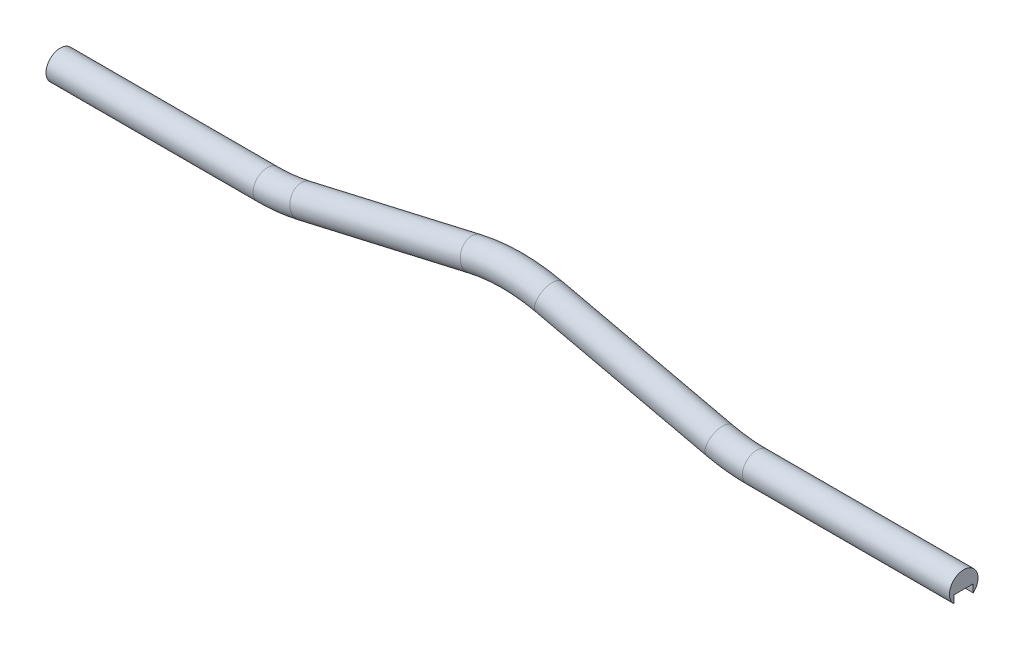
ISO-10303-21;
HEADER;
FILE_DESCRIPTION(('STEP AP214'),'2;1');
FILE_NAME('part.step','',(''),(''),'','','');
FILE_SCHEMA(('AUTOMOTIVE_DESIGN { 1 0 10303 214 1 1 1 1 }'));
ENDSEC;
DATA;
#1=APPLICATION_CONTEXT('core data for automotive mechanical design processes');
#2=APPLICATION_PROTOCOL_DEFINITION('international standard','automotive_design',2000,#1);
#3=PRODUCT_CONTEXT('',#1,'mechanical');
#4=PRODUCT('Part','Part','',(#3));
#5=PRODUCT_RELATED_PRODUCT_CATEGORY('part','',(#4));
#6=PRODUCT_DEFINITION_FORMATION('','',#4);
#7=PRODUCT_DEFINITION_CONTEXT('part definition',#1,'design');
#8=PRODUCT_DEFINITION('design','',#6,#7);
#9=PRODUCT_DEFINITION_SHAPE('','',#8);
#10=(LENGTH_UNIT() NAMED_UNIT(*) SI_UNIT(.MILLI.,.METRE.));
#11=(NAMED_UNIT(*) PLANE_ANGLE_UNIT() SI_UNIT($,.RADIAN.));
#12=(NAMED_UNIT(*) SI_UNIT($,.STERADIAN.) SOLID_ANGLE_UNIT());
#13=UNCERTAINTY_MEASURE_WITH_UNIT(LENGTH_MEASURE(1.E-05),#10,'distance_accuracy_value','');
#14=(GEOMETRIC_REPRESENTATION_CONTEXT(3) GLOBAL_UNCERTAINTY_ASSIGNED_CONTEXT((#13)) GLOBAL_UNIT_ASSIGNED_CONTEXT((#10,
#11,#12)) REPRESENTATION_CONTEXT('',''));
#15=CARTESIAN_POINT('',(0.,0.,0.));
#16=DIRECTION('',(0.,0.,1.));
#17=DIRECTION('',(1.,0.,0.));
#18=AXIS2_PLACEMENT_3D('',#15,#16,#17);
#19=CARTESIAN_POINT('',(475.,1.07597897743096E-12,0.));
#20=DIRECTION('',(-1.,0.,0.));
#21=DIRECTION('',(0.,-1.,0.));
#22=AXIS2_PLACEMENT_3D('',#19,#20,#21);
#23=PLANE('',#22);
#24=DIRECTION('',(0.,1.,0.));
#25=VECTOR('',#24,1.);
#26=CARTESIAN_POINT('',(475.,1.07597897743096E-12,10.));
#27=LINE('',#26,#25);
#28=CARTESIAN_POINT('',(475.,-11.1803398874979,10.));
#29=VERTEX_POINT('',#28);
#30=CARTESIAN_POINT('',(475.,-2.8209459234885,10.));
#31=VERTEX_POINT('',#30);
#32=EDGE_CURVE('E265',#29,#31,#27,.T.);
#33=ORIENTED_EDGE('',*,*,#32,.T.);
#34=DIRECTION('',(0.,0.,-1.));
#35=VECTOR('',#34,1.);
#36=CARTESIAN_POINT('',(475.,-2.8209459234885,0.));
#37=LINE('',#36,#35);
#38=CARTESIAN_POINT('',(475.,-2.8209459234885,-10.));
#39=VERTEX_POINT('',#38);
#40=EDGE_CURVE('E136',#31,#39,#37,.T.);
#41=ORIENTED_EDGE('',*,*,#40,.T.);
#42=DIRECTION('',(0.,-1.,0.));
#43=VECTOR('',#42,1.);
#44=CARTESIAN_POINT('',(475.,1.07597897743096E-12,-10.));
#45=LINE('',#44,#43);
#46=CARTESIAN_POINT('',(475.,-11.1803398874979,-10.));
#47=VERTEX_POINT('',#46);
#48=EDGE_CURVE('E125',#39,#47,#45,.T.);
#49=ORIENTED_EDGE('',*,*,#48,.T.);
#50=CARTESIAN_POINT('',(475.,1.07597897743096E-12,0.));
#51=DIRECTION('',(-1.,0.,0.));
#52=DIRECTION('',(0.,-1.,0.));
#53=AXIS2_PLACEMENT_3D('',#50,#51,#52);
#54=CIRCLE('',#53,15.);
#55=EDGE_CURVE('E171',#29,#47,#54,.T.);
#56=ORIENTED_EDGE('',*,*,#55,.F.);
#57=EDGE_LOOP('',(#33,#41,#49,#56));
#58=FACE_BOUND('',#57,.T.);
#59=ADVANCED_FACE('F44',(#58),#23,.F.);
#60=CARTESIAN_POINT('',(475.,1.07597897743096E-12,0.));
#61=DIRECTION('',(-1.,0.,0.));
#62=DIRECTION('',(0.,-1.,0.));
#63=AXIS2_PLACEMENT_3D('',#60,#61,#62);
#64=CYLINDRICAL_SURFACE('',#63,15.);
#65=CARTESIAN_POINT('',(257.280174441491,0.,0.));
#66=DIRECTION('',(-1.,0.,0.));
#67=DIRECTION('',(0.,-1.,0.));
#68=AXIS2_PLACEMENT_3D('',#65,#66,#67);
#69=CIRCLE('',#68,15.);
#70=CARTESIAN_POINT('',(257.280174441491,-11.1803398874978,9.99999999999999));
#71=VERTEX_POINT('',#70);
#72=CARTESIAN_POINT('',(257.280174441491,-11.1803398874978,-9.99999999999999));
#73=VERTEX_POINT('',#72);
#74=EDGE_CURVE('E174',#71,#73,#69,.T.);
#75=ORIENTED_EDGE('',*,*,#74,.F.);
#76=DIRECTION('',(-1.,0.,0.));
#77=VECTOR('',#76,1.);
#78=CARTESIAN_POINT('',(475.,-11.1803398874979,10.));
#79=LINE('',#78,#77);
#80=EDGE_CURVE('E141',#71,#29,#79,.F.);
#81=ORIENTED_EDGE('',*,*,#80,.T.);
#82=ORIENTED_EDGE('',*,*,#55,.T.);
#83=DIRECTION('',(-1.,0.,0.));
#84=VECTOR('',#83,1.);
#85=CARTESIAN_POINT('',(475.,-11.1803398874979,-10.));
#86=LINE('',#85,#84);
#87=EDGE_CURVE('E137',#47,#73,#86,.T.);
#88=ORIENTED_EDGE('',*,*,#87,.T.);
#89=EDGE_LOOP('',(#75,#81,#82,#88));
#90=FACE_BOUND('',#89,.T.);
#91=ADVANCED_FACE('F236',(#90),#64,.T.);
#92=CARTESIAN_POINT('',(257.280174441491,174.503550262035,0.));
#93=DIRECTION('',(0.,0.,-1.));
#94=DIRECTION('',(-1.,0.,0.));
#95=AXIS2_PLACEMENT_3D('',#92,#93,#94);
#96=TOROIDAL_SURFACE('',#95,174.503550262033,15.);
#97=CARTESIAN_POINT('',(218.221667937682,4.42732581033074,0.));
#98=DIRECTION('',(-0.974629021566136,0.223826429004789,0.));
#99=DIRECTION('',(-0.223826429004789,-0.974629021566136,0.));
#100=AXIS2_PLACEMENT_3D('',#97,#98,#99);
#101=CIRCLE('',#100,15.);
#102=CARTESIAN_POINT('',(214.86427150261,-10.1921095131613,0.));
#103=VERTEX_POINT('',#102);
#104=EDGE_CURVE('E177',#103,#103,#101,.T.);
#105=ORIENTED_EDGE('',*,*,#104,.F.);
#106=EDGE_LOOP('',(#105));
#107=FACE_BOUND('',#106,.T.);
#108=CARTESIAN_POINT('',(237.5,-11.9468901973822,-7.49515836739971));
#109=CARTESIAN_POINT('',(237.5,-11.7348883427465,-7.86062717389537));
#110=CARTESIAN_POINT('',(237.5,-11.507432101741,-8.21707832113065));
#111=CARTESIAN_POINT('',(237.5,-11.0231607113182,-8.9096206849672));
#112=CARTESIAN_POINT('',(237.5,-10.7663374832812,-9.24570626007589));
#113=CARTESIAN_POINT('',(237.5,-10.2249625395837,-9.89537785702519));
#114=CARTESIAN_POINT('',(237.5,-9.94038008531397,-10.2089382536168));
#115=CARTESIAN_POINT('',(237.5,-9.34579193710376,-10.8109501080545));
#116=CARTESIAN_POINT('',(237.5,-9.03578621850345,-11.099401541545));
#117=CARTESIAN_POINT('',(237.5,-8.3928288079994,-11.6489786457779));
#118=CARTESIAN_POINT('',(237.5,-8.05989411341143,-11.9101242043766));
#119=CARTESIAN_POINT('',(237.5,-7.37326025937053,-12.4035281974786));
#120=CARTESIAN_POINT('',(237.5,-7.01956077251465,-12.635786176325));
#121=CARTESIAN_POINT('',(237.5,-6.29402086122989,-13.0697573443422));
#122=CARTESIAN_POINT('',(237.5,-5.92218514846703,-13.2714784114943));
#123=CARTESIAN_POINT('',(237.5,-5.16292844170943,-13.6430712670052));
#124=CARTESIAN_POINT('',(237.5,-4.77550745830767,-13.8129430770109));
#125=CARTESIAN_POINT('',(237.5,-3.98613223842202,-14.1203426735629));
#126=CARTESIAN_POINT('',(237.5,-3.58412299963143,-14.257729226402));
#127=CARTESIAN_POINT('',(237.5,-2.76999522713767,-14.498288827239));
#128=CARTESIAN_POINT('',(237.5,-2.35787665923911,-14.6014617594901));
#129=CARTESIAN_POINT('',(237.5,-1.52641609334729,-14.7729057439063));
#130=CARTESIAN_POINT('',(237.5,-1.10707364074826,-14.8411745911697));
#131=CARTESIAN_POINT('',(237.5,-0.264144135541241,-14.9423471775753));
#132=CARTESIAN_POINT('',(237.5,0.159442928337827,-14.9752508227842));
#133=CARTESIAN_POINT('',(237.5,1.00989201138576,-15.0055514443272));
#134=CARTESIAN_POINT('',(237.5,1.43676004574162,-15.0027798123908));
#135=CARTESIAN_POINT('',(237.5,2.28875183712087,-14.9613499501984));
#136=CARTESIAN_POINT('',(237.5,2.71387558811409,-14.9226915959833));
#137=CARTESIAN_POINT('',(237.5,3.55937226730921,-14.8097607946728));
#138=CARTESIAN_POINT('',(237.5,3.97974513251643,-14.7354878759096));
#139=CARTESIAN_POINT('',(237.5,4.81275333250652,-14.5518434263109));
#140=CARTESIAN_POINT('',(237.5,5.22538866625539,-14.442471890785));
#141=CARTESIAN_POINT('',(237.5,6.04065621626163,-14.1891782134611));
#142=CARTESIAN_POINT('',(237.5,6.4432709849351,-14.0451999056649));
#143=CARTESIAN_POINT('',(237.5,7.23491715090458,-13.7237831699021));
#144=CARTESIAN_POINT('',(237.5,7.62394852280857,-13.5463446793909));
#145=CARTESIAN_POINT('',(237.5,8.3856304956328,-13.1592380298274));
#146=CARTESIAN_POINT('',(237.5,8.75828117256675,-12.9495700203546));
#147=CARTESIAN_POINT('',(237.5,9.48451068321933,-12.4994613114426));
#148=CARTESIAN_POINT('',(237.5,9.83808957178792,-12.2590207005114));
#149=CARTESIAN_POINT('',(237.5,10.5226776466676,-11.7497354981293));
#150=CARTESIAN_POINT('',(237.5,10.8537452774024,-11.4809694707507));
#151=CARTESIAN_POINT('',(237.5,11.4919437623839,-10.9163772342307));
#152=CARTESIAN_POINT('',(237.5,11.7990746386061,-10.6205510499329));
#153=CARTESIAN_POINT('',(237.5,12.3871380832696,-10.0039243974927));
#154=CARTESIAN_POINT('',(237.5,12.668071218538,-9.68312446997007));
#155=CARTESIAN_POINT('',(237.5,13.2016664383657,-9.01881554936907));
#156=CARTESIAN_POINT('',(237.5,13.4543286625541,-8.67530666846282));
#157=CARTESIAN_POINT('',(237.5,13.9279942908009,-7.97026558504523));
#158=CARTESIAN_POINT('',(237.5,14.1491877433987,-7.6088610550722));
#159=CARTESIAN_POINT('',(237.5,14.5601564198921,-6.86860831047156));
#160=CARTESIAN_POINT('',(237.5,14.749931760693,-6.48976016075743));
#161=CARTESIAN_POINT('',(237.5,15.0966386276244,-5.71733591380427));
#162=CARTESIAN_POINT('',(237.5,15.2535712464625,-5.32376030707502));
#163=CARTESIAN_POINT('',(237.5,15.5334181408671,-4.52469493520836));
#164=CARTESIAN_POINT('',(237.5,15.6563325706866,-4.11920522410384));
#165=CARTESIAN_POINT('',(237.5,15.8664681803461,-3.30213274616627));
#166=CARTESIAN_POINT('',(237.5,15.9539351093465,-2.89061316607162));
#167=CARTESIAN_POINT('',(237.5,16.0937560668544,-2.06165201471796));
#168=CARTESIAN_POINT('',(237.5,16.1461102670541,-1.64421047242602));
#169=CARTESIAN_POINT('',(237.5,16.2153113132345,-0.806404915710609));
#170=CARTESIAN_POINT('',(237.5,16.232159032075,-0.386040973383719));
#171=CARTESIAN_POINT('',(237.5,16.2302227406897,0.45460469622664));
#172=CARTESIAN_POINT('',(237.5,16.2114387863903,0.874886423638117));
#173=CARTESIAN_POINT('',(237.5,16.1385295033103,1.71065163049068));
#174=CARTESIAN_POINT('',(237.5,16.084547973009,2.12614766317474));
#175=CARTESIAN_POINT('',(237.5,15.9417859523026,2.95111599354039));
#176=CARTESIAN_POINT('',(237.5,15.8530055822062,3.36058831204246));
#177=CARTESIAN_POINT('',(237.5,15.6413066795661,4.17060834928588));
#178=CARTESIAN_POINT('',(237.5,15.5183882603952,4.57115609766104));
#179=CARTESIAN_POINT('',(237.5,15.2393233236862,5.36050365798531));
#180=CARTESIAN_POINT('',(237.5,15.0831767338317,5.7493034443645));
#181=CARTESIAN_POINT('',(237.5,14.7385987618276,6.51288374793152));
#182=CARTESIAN_POINT('',(237.5,14.5501288802473,6.88764689031009));
#183=CARTESIAN_POINT('',(237.5,14.1424163461415,7.62004023317846));
#184=CARTESIAN_POINT('',(237.5,13.9231736973282,7.97767043573507));
#185=CARTESIAN_POINT('',(237.5,13.4555071521875,8.67332047058686));
#186=CARTESIAN_POINT('',(237.5,13.2070827192689,9.01133994211157));
#187=CARTESIAN_POINT('',(237.5,12.6828496954832,9.66543059682936));
#188=CARTESIAN_POINT('',(237.5,12.4070409803976,9.98150168045079));
#189=CARTESIAN_POINT('',(237.5,11.8283564213234,10.5912777571164));
#190=CARTESIAN_POINT('',(237.5,11.5253341587238,10.8848438021591));
#191=CARTESIAN_POINT('',(237.5,10.8957670249922,11.445563349603));
#192=CARTESIAN_POINT('',(237.5,10.5692220792014,11.7127167681669));
#193=CARTESIAN_POINT('',(237.5,9.89492943540067,12.2187914089477));
#194=CARTESIAN_POINT('',(237.5,9.54718112260284,12.4577118119629));
#195=CARTESIAN_POINT('',(237.5,8.8329529447674,12.9056872256797));
#196=CARTESIAN_POINT('',(237.5,8.4664729957847,13.114742102524));
#197=CARTESIAN_POINT('',(237.5,7.71467517556283,13.5029571386423));
#198=CARTESIAN_POINT('',(237.5,7.32924115981323,13.6818924066154));
#199=CARTESIAN_POINT('',(237.5,6.54472394765828,14.0068067476588));
#200=CARTESIAN_POINT('',(237.5,6.14564068749458,14.1527856667591));
#201=CARTESIAN_POINT('',(237.5,5.33663545204649,14.4107925110824));
#202=CARTESIAN_POINT('',(237.5,4.92671319724459,14.5228195598194));
#203=CARTESIAN_POINT('',(237.5,4.09892707288884,14.7121512998198));
#204=CARTESIAN_POINT('',(237.5,3.68106318450941,14.7894559087631));
#205=CARTESIAN_POINT('',(237.5,2.83820140845463,14.9091131278086));
#206=CARTESIAN_POINT('',(237.5,2.41317812114547,14.9512868963881));
#207=CARTESIAN_POINT('',(237.5,1.56108907692426,14.9997246114071));
#208=CARTESIAN_POINT('',(237.5,1.1340233121799,15.0059884200315));
#209=CARTESIAN_POINT('',(237.5,0.28087497591928,14.9825528854907));
#210=CARTESIAN_POINT('',(237.5,-0.145207586042422,14.9528531943017));
#211=CARTESIAN_POINT('',(237.5,-0.993359125498113,14.857682890381));
#212=CARTESIAN_POINT('',(237.5,-1.41542810534386,14.7922122986106));
#213=CARTESIAN_POINT('',(237.5,-2.25293302061733,14.6258627979867));
#214=CARTESIAN_POINT('',(237.5,-2.66836252411607,14.5249515008966));
#215=CARTESIAN_POINT('',(237.5,-3.48922111456994,14.288418056701));
#216=CARTESIAN_POINT('',(237.5,-3.89465018764602,14.1527958614252));
#217=CARTESIAN_POINT('',(237.5,-4.69259468412761,13.8477719047211));
#218=CARTESIAN_POINT('',(237.5,-5.08511017106702,13.6783703095139));
#219=CARTESIAN_POINT('',(237.5,-5.8543982525807,13.3069585480477));
#220=CARTESIAN_POINT('',(237.5,-6.23117089436273,13.1049484795797));
#221=CARTESIAN_POINT('',(237.5,-6.96509567467492,12.6704064693608));
#222=CARTESIAN_POINT('',(237.5,-7.32230537864273,12.4379717538152));
#223=CARTESIAN_POINT('',(237.5,-8.01578172011708,11.9437154384025));
#224=CARTESIAN_POINT('',(237.5,-8.35204838623849,11.6818938786885));
#225=CARTESIAN_POINT('',(237.5,-9.00118549147761,11.1307065661461));
#226=CARTESIAN_POINT('',(237.5,-9.31405634407764,10.8413413003127));
#227=CARTESIAN_POINT('',(237.5,-9.91411842012224,10.2371077575402));
#228=CARTESIAN_POINT('',(237.5,-10.2013097456971,9.92223958203848));
#229=CARTESIAN_POINT('',(237.5,-10.7464212775853,9.27100726725653));
#230=CARTESIAN_POINT('',(237.5,-11.0044914378975,8.93476863938725));
#231=CARTESIAN_POINT('',(237.5,-11.4912531992839,8.24165836160514));
#232=CARTESIAN_POINT('',(237.5,-11.7199448900762,7.88478677470753));
#233=CARTESIAN_POINT('',(237.5,-12.1462563054261,7.15297269804262));
#234=CARTESIAN_POINT('',(237.5,-12.3438779784149,6.77803134337633));
#235=CARTESIAN_POINT('',(237.5,-12.7066082462742,6.01273832545233));
#236=CARTESIAN_POINT('',(237.5,-12.8717169825009,5.62238672920244));
#237=CARTESIAN_POINT('',(237.5,-13.1673783823378,4.83127311597835));
#238=CARTESIAN_POINT('',(237.5,-13.2981172798437,4.43058069053922));
#239=CARTESIAN_POINT('',(237.5,-13.5252731456618,3.61958099492296));
#240=CARTESIAN_POINT('',(237.5,-13.6216901037783,3.20927372188964));
#241=CARTESIAN_POINT('',(237.5,-13.7795106403472,2.38187757900012));
#242=CARTESIAN_POINT('',(237.5,-13.8409058285415,1.96478710867027));
#243=CARTESIAN_POINT('',(237.5,-13.9281934344373,1.12691452282365));
#244=CARTESIAN_POINT('',(237.5,-13.954086478032,0.706132472520052));
#245=CARTESIAN_POINT('',(237.5,-13.9701566823207,-0.13486874914193));
#246=CARTESIAN_POINT('',(237.5,-13.960439127447,-0.555085911145666));
#247=CARTESIAN_POINT('',(237.5,-13.9055948563114,-1.39320280707954));
#248=CARTESIAN_POINT('',(237.5,-13.8604680512983,-1.81110253519853));
#249=CARTESIAN_POINT('',(237.5,-13.7352015964217,-2.64115859501697));
#250=CARTESIAN_POINT('',(237.5,-13.6551003432098,-3.05332071514159));
#251=CARTESIAN_POINT('',(237.5,-13.4605179040862,-3.8693057396737));
#252=CARTESIAN_POINT('',(237.5,-13.3460459027171,-4.27313084112535));
#253=CARTESIAN_POINT('',(237.5,-13.0530312606269,-5.16226261904901));
#254=CARTESIAN_POINT('',(237.5,-12.8657843556739,-5.64472575782357));
#255=CARTESIAN_POINT('',(237.5,-12.4423611334335,-6.58767525144899));
#256=CARTESIAN_POINT('',(237.5,-12.2061849192945,-7.04816165262678));
#257=CARTESIAN_POINT('',(237.5,-11.9468901973822,-7.49515836739971));
#258=B_SPLINE_CURVE_WITH_KNOTS('',3,(#108,#109,#110,#111,#112,#113,#114,#115,#116,#117,#118,
#119,#120,#121,#122,#123,#124,#125,#126,#127,#128,#129,#130,#131,#132,#133,#134,#135,#136,#137,
#138,#139,#140,#141,#142,#143,#144,#145,#146,#147,#148,#149,#150,#151,#152,#153,#154,#155,#156,
#157,#158,#159,#160,#161,#162,#163,#164,#165,#166,#167,#168,#169,#170,#171,#172,#173,#174,#175,
#176,#177,#178,#179,#180,#181,#182,#183,#184,#185,#186,#187,#188,#189,#190,#191,#192,#193,#194,
#195,#196,#197,#198,#199,#200,#201,#202,#203,#204,#205,#206,#207,#208,#209,#210,#211,#212,#213,
#214,#215,#216,#217,#218,#219,#220,#221,#222,#223,#224,#225,#226,#227,#228,#229,#230,#231,#232,
#233,#234,#235,#236,#237,#238,#239,#240,#241,#242,#243,#244,#245,#246,#247,#248,#249,#250,#251,
#252,#253,#254,#255,#256,#257),.UNSPECIFIED.,.T.,.F.,(4,2,2,2,2,2,2,2,2,2,2,2,2,2,2,2,2,2,2,2,2,
2,2,2,2,2,2,2,2,2,2,2,2,2,2,2,2,2,2,2,2,2,2,2,2,2,2,2,2,2,2,2,2,2,2,2,2,2,2,2,2,2,2,2,2,2,2,2,2,
2,2,2,2,2,4),(0.,1.2670654732137,2.53448034822782,3.80331495484445,5.07215079220751,
6.34005595722439,7.60798111894728,8.87557861898149,10.1431752574711,11.4161855640153,
12.6892001771856,13.9622951971451,15.2353935985617,16.5145111101443,17.7936330400434,
19.0727719106927,20.3519109522783,21.6331401940193,22.914371830688,24.1955975212451,
25.4768195268347,26.7545770348162,28.0323333697162,29.3100620520402,30.5877844234242,
31.8574290428471,33.1270689378848,34.3966665841176,35.6662584733537,36.9268914811873,
38.1875183248053,39.4481141779341,40.7087080524763,41.964183813904,43.2196552348638,
44.4751224864413,45.7305924703978,46.9875683310378,48.2445440400442,49.5015428657831,
50.7585473936842,52.0227745187023,53.2870056564278,54.5512734677523,55.8155469453405,
57.0888775336802,58.3622140708152,59.6355834770184,60.9089559021102,62.1887717745529,
63.4685925586573,64.7484257278629,66.028258147103,67.3092632247521,68.5902700801375,
69.8712706321193,71.1522673425137,72.4292660730017,73.7062630586641,74.9832374701791,
76.260206802802,77.5302675952605,78.800324509025,80.0703017444803,81.3402734583471,
82.6032149342202,83.8661567852664,85.1294010757,86.3926230951971,87.6521133558099,
88.9116067732691,90.1697209206638,91.4274991738691,92.9772218528873,94.5269412649473),.UNSPECIFIED.);
#259=CARTESIAN_POINT('',(237.5,-10.1237818427419,10.));
#260=VERTEX_POINT('',#259);
#261=CARTESIAN_POINT('',(237.5,-10.1237818427419,-10.));
#262=VERTEX_POINT('',#261);
#263=EDGE_CURVE('E206',#260,#262,#258,.T.);
#264=ORIENTED_EDGE('',*,*,#263,.F.);
#265=CARTESIAN_POINT('',(257.280174441491,174.503550262035,10.));
#266=DIRECTION('',(0.,0.,-1.));
#267=DIRECTION('',(-1.,0.,0.));
#268=AXIS2_PLACEMENT_3D('',#265,#266,#267);
#269=CIRCLE('',#268,185.683890149532);
#270=EDGE_CURVE('E12',#260,#71,#269,.F.);
#271=ORIENTED_EDGE('',*,*,#270,.T.);
#272=ORIENTED_EDGE('',*,*,#74,.T.);
#273=CARTESIAN_POINT('',(257.280174441491,174.503550262035,-10.));
#274=DIRECTION('',(0.,0.,1.));
#275=DIRECTION('',(1.,0.,0.));
#276=AXIS2_PLACEMENT_3D('',#273,#274,#275);
#277=CIRCLE('',#276,185.683890149532);
#278=EDGE_CURVE('E51',#73,#262,#277,.F.);
#279=ORIENTED_EDGE('',*,*,#278,.T.);
#280=EDGE_LOOP('',(#264,#271,#272,#279));
#281=FACE_BOUND('',#280,.T.);
#282=ADVANCED_FACE('F238',(#107,#281),#96,.T.);
#283=CARTESIAN_POINT('',(-475.,2.34746657989747E-12,0.));
#284=DIRECTION('',(-1.,0.,0.));
#285=DIRECTION('',(0.,-1.,0.));
#286=AXIS2_PLACEMENT_3D('',#283,#284,#285);
#287=PLANE('',#286);
#288=DIRECTION('',(0.,1.,0.));
#289=VECTOR('',#288,1.);
#290=CARTESIAN_POINT('',(-475.,-27.1790540765068,10.));
#291=LINE('',#290,#289);
#292=CARTESIAN_POINT('',(-475.,-11.1803398874966,10.));
#293=VERTEX_POINT('',#292);
#294=CARTESIAN_POINT('',(-475.,-2.8209459234885,10.));
#295=VERTEX_POINT('',#294);
#296=EDGE_CURVE('E148',#293,#295,#291,.T.);
#297=ORIENTED_EDGE('',*,*,#296,.F.);
#298=CARTESIAN_POINT('',(-475.,2.34746657989747E-12,0.));
#299=DIRECTION('',(-1.,0.,0.));
#300=DIRECTION('',(0.,-1.,0.));
#301=AXIS2_PLACEMENT_3D('',#298,#299,#300);
#302=CIRCLE('',#301,15.);
#303=CARTESIAN_POINT('',(-475.,-11.1803398874966,-10.));
#304=VERTEX_POINT('',#303);
#305=EDGE_CURVE('E192',#293,#304,#302,.T.);
#306=ORIENTED_EDGE('',*,*,#305,.T.);
#307=DIRECTION('',(0.,-1.,0.));
#308=VECTOR('',#307,1.);
#309=CARTESIAN_POINT('',(-475.,-27.1790540765068,-10.));
#310=LINE('',#309,#308);
#311=CARTESIAN_POINT('',(-475.,-2.8209459234885,-10.));
#312=VERTEX_POINT('',#311);
#313=EDGE_CURVE('E66',#312,#304,#310,.T.);
#314=ORIENTED_EDGE('',*,*,#313,.F.);
#315=DIRECTION('',(0.,0.,-1.));
#316=VECTOR('',#315,1.);
#317=CARTESIAN_POINT('',(-475.,-2.8209459234885,-10.));
#318=LINE('',#317,#316);
#319=EDGE_CURVE('E159',#295,#312,#318,.T.);
#320=ORIENTED_EDGE('',*,*,#319,.F.);
#321=EDGE_LOOP('',(#297,#306,#314,#320));
#322=FACE_BOUND('',#321,.T.);
#323=ADVANCED_FACE('F235',(#322),#287,.T.);
#324=CARTESIAN_POINT('',(218.221667937682,4.4273258103308,0.));
#325=DIRECTION('',(-0.974629021566136,0.22382642900479,0.));
#326=DIRECTION('',(-0.22382642900479,-0.974629021566136,0.));
#327=AXIS2_PLACEMENT_3D('',#324,#325,#326);
#328=CYLINDRICAL_SURFACE('',#327,15.);
#329=CARTESIAN_POINT('',(39.0585065038092,45.5726741896692,0.));
#330=DIRECTION('',(-0.974629021566136,0.22382642900479,0.));
#331=DIRECTION('',(-0.22382642900479,-0.974629021566136,0.));
#332=AXIS2_PLACEMENT_3D('',#329,#330,#331);
#333=CIRCLE('',#332,15.);
#334=CARTESIAN_POINT('',(42.415902938881,60.1921095131612,0.));
#335=VERTEX_POINT('',#334);
#336=EDGE_CURVE('E180',#335,#335,#333,.T.);
#337=ORIENTED_EDGE('',*,*,#336,.F.);
#338=EDGE_LOOP('',(#337));
#339=FACE_BOUND('',#338,.T.);
#340=ORIENTED_EDGE('',*,*,#104,.T.);
#341=EDGE_LOOP('',(#340));
#342=FACE_BOUND('',#341,.T.);
#343=ADVANCED_FACE('F244',(#339,#342),#328,.T.);
#344=CARTESIAN_POINT('',(0.,-124.503550262035,0.));
#345=DIRECTION('',(0.,0.,1.));
#346=DIRECTION('',(1.,0.,0.));
#347=AXIS2_PLACEMENT_3D('',#344,#345,#346);
#348=TOROIDAL_SURFACE('',#347,174.503550262035,15.);
#349=CARTESIAN_POINT('',(-39.058506503809,45.5726741896692,0.));
#350=DIRECTION('',(-0.974629021566136,-0.22382642900479,0.));
#351=DIRECTION('',(0.22382642900479,-0.974629021566136,0.));
#352=AXIS2_PLACEMENT_3D('',#349,#350,#351);
#353=CIRCLE('',#352,15.);
#354=CARTESIAN_POINT('',(-42.4159029388809,60.1921095131613,0.));
#355=VERTEX_POINT('',#354);
#356=EDGE_CURVE('E183',#355,#355,#353,.T.);
#357=CARTESIAN_POINT('',(0.,-124.503550262035,0.));
#358=DIRECTION('',(0.,0.,1.));
#359=DIRECTION('',(1.,0.,0.));
#360=AXIS2_PLACEMENT_3D('',#357,#358,#359);
#361=CIRCLE('',#360,189.503550262035);
#362=EDGE_CURVE('',#335,#355,#361,.T.);
#363=ORIENTED_EDGE('',*,*,#336,.T.);
#364=ORIENTED_EDGE('',*,*,#356,.F.);
#365=ORIENTED_EDGE('',*,*,#362,.T.);
#366=ORIENTED_EDGE('',*,*,#362,.F.);
#367=EDGE_LOOP('',(#363,#365,#364,#366));
#368=FACE_BOUND('',#367,.T.);
#369=ADVANCED_FACE('F247',(#368),#348,.T.);
#370=CARTESIAN_POINT('',(-39.0585065038092,45.5726741896693,0.));
#371=DIRECTION('',(-0.974629021566136,-0.22382642900479,0.));
#372=DIRECTION('',(0.22382642900479,-0.974629021566136,0.));
#373=AXIS2_PLACEMENT_3D('',#370,#371,#372);
#374=CYLINDRICAL_SURFACE('',#373,15.);
#375=CARTESIAN_POINT('',(-218.221667937682,4.42732581033078,0.));
#376=DIRECTION('',(-0.974629021566136,-0.22382642900479,0.));
#377=DIRECTION('',(0.22382642900479,-0.974629021566136,0.));
#378=AXIS2_PLACEMENT_3D('',#375,#376,#377);
#379=CIRCLE('',#378,15.);
#380=CARTESIAN_POINT('',(-214.86427150261,-10.1921095131613,0.));
#381=VERTEX_POINT('',#380);
#382=EDGE_CURVE('E186',#381,#381,#379,.T.);
#383=ORIENTED_EDGE('',*,*,#382,.F.);
#384=EDGE_LOOP('',(#383));
#385=FACE_BOUND('',#384,.T.);
#386=ORIENTED_EDGE('',*,*,#356,.T.);
#387=EDGE_LOOP('',(#386));
#388=FACE_BOUND('',#387,.T.);
#389=ADVANCED_FACE('F250',(#385,#388),#374,.T.);
#390=CARTESIAN_POINT('',(-257.280174441491,174.503550262035,0.));
#391=DIRECTION('',(0.,0.,-1.));
#392=DIRECTION('',(-1.,0.,0.));
#393=AXIS2_PLACEMENT_3D('',#390,#391,#392);
#394=TOROIDAL_SURFACE('',#393,174.503550262035,15.);
#395=CARTESIAN_POINT('',(-257.280174441491,174.503550262035,10.));
#396=DIRECTION('',(0.,0.,1.));
#397=DIRECTION('',(1.,0.,0.));
#398=AXIS2_PLACEMENT_3D('',#395,#396,#397);
#399=CIRCLE('',#398,185.683890149534);
#400=CARTESIAN_POINT('',(-237.5,-10.1237818427441,10.));
#401=VERTEX_POINT('',#400);
#402=CARTESIAN_POINT('',(-257.280174441491,-11.1803398874966,10.));
#403=VERTEX_POINT('',#402);
#404=EDGE_CURVE('E169',#401,#403,#399,.F.);
#405=ORIENTED_EDGE('',*,*,#404,.F.);
#406=CARTESIAN_POINT('',(-237.5,-11.9468901973834,-7.49515836740143));
#407=CARTESIAN_POINT('',(-237.5,-12.1574909044477,-7.1321171722472));
#408=CARTESIAN_POINT('',(-237.5,-12.3527915884673,-6.76026237035247));
#409=CARTESIAN_POINT('',(-237.5,-12.7115043227994,-6.00133080138751));
#410=CARTESIAN_POINT('',(-237.5,-12.8749083387956,-5.6142502285869));
#411=CARTESIAN_POINT('',(-237.5,-13.1687071024198,-4.82730972448943));
#412=CARTESIAN_POINT('',(-237.5,-13.2990676192738,-4.42743702031352));
#413=CARTESIAN_POINT('',(-237.5,-13.5256108983983,-3.61812445949164));
#414=CARTESIAN_POINT('',(-237.5,-13.6217938632984,-3.20868465958175));
#415=CARTESIAN_POINT('',(-237.5,-13.7792469842361,-2.38330487296943));
#416=CARTESIAN_POINT('',(-237.5,-13.8405301643943,-1.96736737073658));
#417=CARTESIAN_POINT('',(-237.5,-13.9277905593948,-1.1317983220681));
#418=CARTESIAN_POINT('',(-237.5,-13.9537672322034,-0.712166719019335));
#419=CARTESIAN_POINT('',(-237.5,-13.9702199131087,0.127688440041097));
#420=CARTESIAN_POINT('',(-237.5,-13.9607046536514,0.547911825018686));
#421=CARTESIAN_POINT('',(-237.5,-13.9062629666001,1.38605652603984));
#422=CARTESIAN_POINT('',(-237.5,-13.8613367028506,1.80397785272588));
#423=CARTESIAN_POINT('',(-237.5,-13.7364787826406,2.63403936693425));
#424=CARTESIAN_POINT('',(-237.5,-13.6565896185894,3.04618594727781));
#425=CARTESIAN_POINT('',(-237.5,-13.4623992856284,3.86229029001008));
#426=CARTESIAN_POINT('',(-237.5,-13.3480981239851,4.2662480541279));
#427=CARTESIAN_POINT('',(-237.5,-13.0859131594016,5.06312914193968));
#428=CARTESIAN_POINT('',(-237.5,-12.9380281775526,5.45605207772858));
#429=CARTESIAN_POINT('',(-237.5,-12.6097538798053,6.22807612635184));
#430=CARTESIAN_POINT('',(-237.5,-12.429364520806,6.6071772208575));
#431=CARTESIAN_POINT('',(-237.5,-12.0371307994373,7.34938198468769));
#432=CARTESIAN_POINT('',(-237.5,-11.8252452327354,7.71246387794155));
#433=CARTESIAN_POINT('',(-237.5,-11.3717303555261,8.41954889430242));
#434=CARTESIAN_POINT('',(-237.5,-11.1301010365891,8.76355201200236));
#435=CARTESIAN_POINT('',(-237.5,-10.6188383538221,9.43008160452029));
#436=CARTESIAN_POINT('',(-237.5,-10.3492047062461,9.75260786167566));
#437=CARTESIAN_POINT('',(-237.5,-9.78387007991732,10.3739417066974));
#438=CARTESIAN_POINT('',(-237.5,-9.48816901757679,10.6727492185015));
#439=CARTESIAN_POINT('',(-237.5,-8.87151896365857,11.2457838946889));
#440=CARTESIAN_POINT('',(-237.5,-8.5504692473425,11.519902670114));
#441=CARTESIAN_POINT('',(-237.5,-7.88651161882045,12.0402475914926));
#442=CARTESIAN_POINT('',(-237.5,-7.54360365737718,12.2864736746122));
#443=CARTESIAN_POINT('',(-237.5,-6.83836559377177,12.7493470538684));
#444=CARTESIAN_POINT('',(-237.5,-6.47603511248071,12.9659937723206));
#445=CARTESIAN_POINT('',(-237.5,-5.73452550170625,13.3682259408565));
#446=CARTESIAN_POINT('',(-237.5,-5.35534631039881,13.5538112769526));
#447=CARTESIAN_POINT('',(-237.5,-4.58063290636413,13.8936198095956));
#448=CARTESIAN_POINT('',(-237.5,-4.18501851664618,14.0476602307829));
#449=CARTESIAN_POINT('',(-237.5,-3.38226214570683,14.3220099683563));
#450=CARTESIAN_POINT('',(-237.5,-2.97512012351959,14.442319164855));
#451=CARTESIAN_POINT('',(-237.5,-2.15217653937316,14.6483975435599));
#452=CARTESIAN_POINT('',(-237.5,-1.73637476354639,14.7341658716533));
#453=CARTESIAN_POINT('',(-237.5,-0.899050058005269,14.8705856481419));
#454=CARTESIAN_POINT('',(-237.5,-0.477527112563767,14.9212369999825));
#455=CARTESIAN_POINT('',(-237.5,0.3703891583797,14.9872538430676));
#456=CARTESIAN_POINT('',(-237.5,0.796796288576014,15.0024421332388));
#457=CARTESIAN_POINT('',(-237.5,1.64937873364192,14.9969205160221));
#458=CARTESIAN_POINT('',(-237.5,2.07555404767001,14.9762104791812));
#459=CARTESIAN_POINT('',(-237.5,2.92466305182079,14.8990425801695));
#460=CARTESIAN_POINT('',(-237.5,3.3475966892921,14.8425841386125));
#461=CARTESIAN_POINT('',(-237.5,4.18722089268658,14.6943129713082));
#462=CARTESIAN_POINT('',(-237.5,4.60391145564471,14.6025002287706));
#463=CARTESIAN_POINT('',(-237.5,5.42896924879345,14.3839232855208));
#464=CARTESIAN_POINT('',(-237.5,5.83731697021428,14.2570854327992));
#465=CARTESIAN_POINT('',(-237.5,6.64186101791008,13.9694199550269));
#466=CARTESIAN_POINT('',(-237.5,7.03805731798343,13.8085922566913));
#467=CARTESIAN_POINT('',(-237.5,7.81545803176688,13.4540605287259));
#468=CARTESIAN_POINT('',(-237.5,8.1966624452682,13.2603564986382));
#469=CARTESIAN_POINT('',(-237.5,8.94133247842477,12.8414163793978));
#470=CARTESIAN_POINT('',(-237.5,9.30479814268862,12.6161803695458));
#471=CARTESIAN_POINT('',(-237.5,10.0105957530952,12.136262812826));
#472=CARTESIAN_POINT('',(-237.5,10.352971527066,11.8816457245158));
#473=CARTESIAN_POINT('',(-237.5,11.0149509381889,11.3443519109935));
#474=CARTESIAN_POINT('',(-237.5,11.3345545875908,11.0616752008757));
#475=CARTESIAN_POINT('',(-237.5,11.9486432302445,10.470250819966));
#476=CARTESIAN_POINT('',(-237.5,12.2431287400363,10.1615036855573));
#477=CARTESIAN_POINT('',(-237.5,12.8048142786631,9.52011379083014));
#478=CARTESIAN_POINT('',(-237.5,13.0720144382663,9.18747114504657));
#479=CARTESIAN_POINT('',(-237.5,13.5756284959072,8.50271324019286));
#480=CARTESIAN_POINT('',(-237.5,13.8122171611364,8.1507265102645));
#481=CARTESIAN_POINT('',(-237.5,14.2547179599283,7.42797029908389));
#482=CARTESIAN_POINT('',(-237.5,14.4606301985763,7.05720088217949));
#483=CARTESIAN_POINT('',(-237.5,14.8402341678852,6.29953303503831));
#484=CARTESIAN_POINT('',(-237.5,15.0139269450488,5.91263512916222));
#485=CARTESIAN_POINT('',(-237.5,15.327793277969,5.12547374316217));
#486=CARTESIAN_POINT('',(-237.5,15.467966992739,4.72521032645403));
#487=CARTESIAN_POINT('',(-237.5,15.7128530181789,3.91711497184677));
#488=CARTESIAN_POINT('',(-237.5,15.8178124704872,3.50935791297547));
#489=CARTESIAN_POINT('',(-237.5,15.9928596890476,2.68642649188945));
#490=CARTESIAN_POINT('',(-237.5,16.0629476254832,2.2712521658835));
#491=CARTESIAN_POINT('',(-237.5,16.1677232494269,1.43647153916104));
#492=CARTESIAN_POINT('',(-237.5,16.2024118864227,1.01686535762175));
#493=CARTESIAN_POINT('',(-237.5,16.2361305200519,0.176222795086107));
#494=CARTESIAN_POINT('',(-237.5,16.2351605891623,-0.244813583001592));
#495=CARTESIAN_POINT('',(-237.5,16.1976565958298,-1.08335178774546));
#496=CARTESIAN_POINT('',(-237.5,16.1612865497599,-1.50086096033526));
#497=CARTESIAN_POINT('',(-237.5,16.0534958559032,-2.33132829953117));
#498=CARTESIAN_POINT('',(-237.5,15.9820753403286,-2.74428648329784));
#499=CARTESIAN_POINT('',(-237.5,15.8047167479926,-3.56271919065651));
#500=CARTESIAN_POINT('',(-237.5,15.6987788731918,-3.96819375802038));
#501=CARTESIAN_POINT('',(-237.5,15.4531721660398,-4.76879449979827));
#502=CARTESIAN_POINT('',(-237.5,15.3135032747743,-5.16392065613657));
#503=CARTESIAN_POINT('',(-237.5,15.0013862420372,-5.94124252511732));
#504=CARTESIAN_POINT('',(-237.5,14.8289212362278,-6.32343146558252));
#505=CARTESIAN_POINT('',(-237.5,14.4525269720586,-7.07198605236231));
#506=CARTESIAN_POINT('',(-237.5,14.2485977319794,-7.43835170786998));
#507=CARTESIAN_POINT('',(-237.5,13.8107603443494,-8.15271429577869));
#508=CARTESIAN_POINT('',(-237.5,13.5768517467906,-8.50071095233941));
#509=CARTESIAN_POINT('',(-237.5,13.0807523027733,-9.17592370307714));
#510=CARTESIAN_POINT('',(-237.5,12.8185613328618,-9.5031397065364));
#511=CARTESIAN_POINT('',(-237.5,12.2663169456992,-10.1362219903916));
#512=CARTESIAN_POINT('',(-237.5,11.976122861612,-10.441965568639));
#513=CARTESIAN_POINT('',(-237.5,11.3711464179131,-11.0280709259425));
#514=CARTESIAN_POINT('',(-237.5,11.0563639886063,-11.3084326330493));
#515=CARTESIAN_POINT('',(-237.5,10.4044512668254,-11.8418625243375));
#516=CARTESIAN_POINT('',(-237.5,10.0673202950123,-12.0949298782249));
#517=CARTESIAN_POINT('',(-237.5,9.37311071654319,-12.5720393289551));
#518=CARTESIAN_POINT('',(-237.5,9.01603201773027,-12.7960812916869));
#519=CARTESIAN_POINT('',(-237.5,8.28181080230314,-13.215124353315));
#520=CARTESIAN_POINT('',(-237.5,7.90454246955477,-13.4099050298672));
#521=CARTESIAN_POINT('',(-237.5,7.13500319318252,-13.7671491089302));
#522=CARTESIAN_POINT('',(-237.5,6.74273218031929,-13.9296123622704));
#523=CARTESIAN_POINT('',(-237.5,5.94595011512073,-14.2211162669292));
#524=CARTESIAN_POINT('',(-237.5,5.54143871466723,-14.3501559666781));
#525=CARTESIAN_POINT('',(-237.5,4.72303518262373,-14.5739262760686));
#526=CARTESIAN_POINT('',(-237.5,4.30914302578733,-14.6686567933625));
#527=CARTESIAN_POINT('',(-237.5,3.47258998076773,-14.8235851136502));
#528=CARTESIAN_POINT('',(-237.5,3.04989340108951,-14.8835902585191));
#529=CARTESIAN_POINT('',(-237.5,2.20095012940902,-14.9678386399104));
#530=CARTESIAN_POINT('',(-237.5,1.77470342232714,-14.9920817244509));
#531=CARTESIAN_POINT('',(-237.5,0.921691760895627,-15.0046301764287));
#532=CARTESIAN_POINT('',(-237.5,0.494926820020579,-14.9929364590712));
#533=CARTESIAN_POINT('',(-237.5,-0.3561056396177,-14.9336828360636));
#534=CARTESIAN_POINT('',(-237.5,-0.780373161442491,-14.8861229743906));
#535=CARTESIAN_POINT('',(-237.5,-1.62397488739562,-14.7553628371373));
#536=CARTESIAN_POINT('',(-237.5,-2.04330156061315,-14.6721139635475));
#537=CARTESIAN_POINT('',(-237.5,-2.87343824170502,-14.4705303744431));
#538=CARTESIAN_POINT('',(-237.5,-3.28424820157616,-14.3521954612287));
#539=CARTESIAN_POINT('',(-237.5,-4.09450688717122,-14.0812145377084));
#540=CARTESIAN_POINT('',(-237.5,-4.49395275346893,-13.9285599764444));
#541=CARTESIAN_POINT('',(-237.5,-5.27849380678133,-13.5900114828048));
#542=CARTESIAN_POINT('',(-237.5,-5.66358925924353,-13.4041181656339));
#543=CARTESIAN_POINT('',(-237.5,-6.41582389404945,-13.0008247098668));
#544=CARTESIAN_POINT('',(-237.5,-6.78300068895465,-12.7834947315974));
#545=CARTESIAN_POINT('',(-237.5,-7.49764283007165,-12.3185394107358));
#546=CARTESIAN_POINT('',(-237.5,-7.84510820861012,-12.0709141178301));
#547=CARTESIAN_POINT('',(-237.5,-8.51743741005649,-11.5473831387668));
#548=CARTESIAN_POINT('',(-237.5,-8.84232552613836,-11.2715086652023));
#549=CARTESIAN_POINT('',(-237.5,-9.46744124820313,-10.6933041476813));
#550=CARTESIAN_POINT('',(-237.5,-9.76767540088917,-10.3909811712847));
#551=CARTESIAN_POINT('',(-237.5,-10.4146716064247,-9.68157406356215));
#552=CARTESIAN_POINT('',(-237.5,-10.7537538923581,-9.26744443713891));
#553=CARTESIAN_POINT('',(-237.5,-11.3857888120422,-8.40535875855384));
#554=CARTESIAN_POINT('',(-237.5,-11.6787415590893,-7.95740278947514));
#555=CARTESIAN_POINT('',(-237.5,-11.9468901973834,-7.49515836740143));
#556=B_SPLINE_CURVE_WITH_KNOTS('',3,(#406,#407,#408,#409,#410,#411,#412,#413,#414,#415,#416,
#417,#418,#419,#420,#421,#422,#423,#424,#425,#426,#427,#428,#429,#430,#431,#432,#433,#434,#435,
#436,#437,#438,#439,#440,#441,#442,#443,#444,#445,#446,#447,#448,#449,#450,#451,#452,#453,#454,
#455,#456,#457,#458,#459,#460,#461,#462,#463,#464,#465,#466,#467,#468,#469,#470,#471,#472,#473,
#474,#475,#476,#477,#478,#479,#480,#481,#482,#483,#484,#485,#486,#487,#488,#489,#490,#491,#492,
#493,#494,#495,#496,#497,#498,#499,#500,#501,#502,#503,#504,#505,#506,#507,#508,#509,#510,#511,
#512,#513,#514,#515,#516,#517,#518,#519,#520,#521,#522,#523,#524,#525,#526,#527,#528,#529,#530,
#531,#532,#533,#534,#535,#536,#537,#538,#539,#540,#541,#542,#543,#544,#545,#546,#547,#548,#549,
#550,#551,#552,#553,#554,#555),.UNSPECIFIED.,.T.,.F.,(4,2,2,2,2,2,2,2,2,2,2,2,2,2,2,2,2,2,2,2,2,
2,2,2,2,2,2,2,2,2,2,2,2,2,2,2,2,2,2,2,2,2,2,2,2,2,2,2,2,2,2,2,2,2,2,2,2,2,2,2,2,2,2,2,2,2,2,2,2,
2,2,2,2,2,4),(0.,1.25864850572465,2.51761363913383,3.77787769156645,5.03813427210662,
6.29792023346769,7.55772553513173,8.8172208943577,10.0767104260087,11.3346734606829,
12.5926362297276,13.8506431644694,15.1086517673522,16.3683208619347,17.6279903135149,
18.8876725295874,20.147358785101,21.4123301675321,22.6773043995035,23.9423033328569,
25.2073069083349,26.4794447068509,27.7515870267404,29.0237608017288,30.295938074557,
31.574458656785,32.852983849503,34.1315297642373,35.4100762861717,36.6913321267444,
37.9725907298429,39.2538493507856,40.5351047495129,41.8136008363608,43.0920962354646,
44.3705653367134,45.6490283104697,46.9198358560704,48.190639048289,49.4614009570165,
50.7321568371698,51.9937979958753,53.2554329973278,54.5170341580398,55.7786327545096,
57.0344137814965,58.2901900716485,59.5459590144033,60.8017301504826,62.0581487808794,
63.3145666813073,64.5710034435238,65.827445690327,67.0905651570422,68.353688204171,
69.6168496646609,70.8800169613439,72.1522678575047,73.4245246259814,74.6968176116716,
75.9691140218844,77.2484031482632,78.5276977113593,79.8069596948315,81.0862201097426,
82.3672280645785,83.6482432376655,84.9295779382317,86.2108889254661,87.4893831850542,
88.7678753478546,90.0449698393486,91.3217241024286,92.9243099462698,94.5268918540212),.UNSPECIFIED.);
#557=CARTESIAN_POINT('',(-237.5,-10.1237818427441,-10.));
#558=VERTEX_POINT('',#557);
#559=EDGE_CURVE('E199',#558,#401,#556,.T.);
#560=ORIENTED_EDGE('',*,*,#559,.F.);
#561=CARTESIAN_POINT('',(-257.280174441491,174.503550262035,-10.));
#562=DIRECTION('',(0.,0.,-1.));
#563=DIRECTION('',(-1.,0.,0.));
#564=AXIS2_PLACEMENT_3D('',#561,#562,#563);
#565=CIRCLE('',#564,185.683890149534);
#566=CARTESIAN_POINT('',(-257.280174441491,-11.1803398874966,-10.));
#567=VERTEX_POINT('',#566);
#568=EDGE_CURVE('E165',#567,#558,#565,.F.);
#569=ORIENTED_EDGE('',*,*,#568,.F.);
#570=CARTESIAN_POINT('',(-257.280174441491,2.34746657989747E-12,0.));
#571=DIRECTION('',(-1.,0.,0.));
#572=DIRECTION('',(0.,-1.,0.));
#573=AXIS2_PLACEMENT_3D('',#570,#571,#572);
#574=CIRCLE('',#573,15.);
#575=EDGE_CURVE('E189',#403,#567,#574,.T.);
#576=ORIENTED_EDGE('',*,*,#575,.F.);
#577=EDGE_LOOP('',(#405,#560,#569,#576));
#578=FACE_BOUND('',#577,.T.);
#579=ORIENTED_EDGE('',*,*,#382,.T.);
#580=EDGE_LOOP('',(#579));
#581=FACE_BOUND('',#580,.T.);
#582=ADVANCED_FACE('F212',(#578,#581),#394,.T.);
#583=CARTESIAN_POINT('',(-257.280174441491,2.34746657989747E-12,0.));
#584=DIRECTION('',(-1.,0.,0.));
#585=DIRECTION('',(0.,0.,1.));
#586=AXIS2_PLACEMENT_3D('',#583,#584,#585);
#587=CYLINDRICAL_SURFACE('',#586,15.);
#588=DIRECTION('',(-1.,0.,0.));
#589=VECTOR('',#588,1.);
#590=CARTESIAN_POINT('',(-257.280174441491,-11.1803398874966,10.));
#591=LINE('',#590,#589);
#592=EDGE_CURVE('E197',#403,#293,#591,.T.);
#593=ORIENTED_EDGE('',*,*,#592,.F.);
#594=ORIENTED_EDGE('',*,*,#575,.T.);
#595=DIRECTION('',(-1.,0.,0.));
#596=VECTOR('',#595,1.);
#597=CARTESIAN_POINT('',(-257.280174441491,-11.1803398874966,-10.));
#598=LINE('',#597,#596);
#599=EDGE_CURVE('E195',#304,#567,#598,.F.);
#600=ORIENTED_EDGE('',*,*,#599,.F.);
#601=ORIENTED_EDGE('',*,*,#305,.F.);
#602=EDGE_LOOP('',(#593,#594,#600,#601));
#603=FACE_BOUND('',#602,.T.);
#604=ADVANCED_FACE('F233',(#603),#587,.T.);
#605=CARTESIAN_POINT('',(-237.5,-27.1790540765068,10.));
#606=DIRECTION('',(0.,0.,1.));
#607=DIRECTION('',(1.,0.,0.));
#608=AXIS2_PLACEMENT_3D('',#605,#606,#607);
#609=PLANE('',#608);
#610=ORIENTED_EDGE('',*,*,#404,.T.);
#611=ORIENTED_EDGE('',*,*,#592,.T.);
#612=ORIENTED_EDGE('',*,*,#296,.T.);
#613=DIRECTION('',(-1.,0.,0.));
#614=VECTOR('',#613,1.);
#615=CARTESIAN_POINT('',(-237.5,-2.8209459234885,10.));
#616=LINE('',#615,#614);
#617=CARTESIAN_POINT('',(-237.5,-2.8209459234885,10.));
#618=VERTEX_POINT('',#617);
#619=EDGE_CURVE('E157',#618,#295,#616,.T.);
#620=ORIENTED_EDGE('',*,*,#619,.F.);
#621=DIRECTION('',(0.,1.,0.));
#622=VECTOR('',#621,1.);
#623=CARTESIAN_POINT('',(-237.5,-27.1790540765068,10.));
#624=LINE('',#623,#622);
#625=EDGE_CURVE('E149',#401,#618,#624,.T.);
#626=ORIENTED_EDGE('',*,*,#625,.F.);
#627=EDGE_LOOP('',(#610,#611,#612,#620,#626));
#628=FACE_BOUND('',#627,.T.);
#629=ADVANCED_FACE('F227',(#628),#609,.F.);
#630=CARTESIAN_POINT('',(-237.5,-27.1790540765068,-10.));
#631=DIRECTION('',(0.,0.,-1.));
#632=DIRECTION('',(-1.,0.,0.));
#633=AXIS2_PLACEMENT_3D('',#630,#631,#632);
#634=PLANE('',#633);
#635=ORIENTED_EDGE('',*,*,#568,.T.);
#636=DIRECTION('',(0.,-1.,0.));
#637=VECTOR('',#636,1.);
#638=CARTESIAN_POINT('',(-237.5,-27.1790540765068,-10.));
#639=LINE('',#638,#637);
#640=CARTESIAN_POINT('',(-237.5,-2.8209459234885,-10.));
#641=VERTEX_POINT('',#640);
#642=EDGE_CURVE('E154',#641,#558,#639,.T.);
#643=ORIENTED_EDGE('',*,*,#642,.F.);
#644=DIRECTION('',(-1.,0.,0.));
#645=VECTOR('',#644,1.);
#646=CARTESIAN_POINT('',(-237.5,-2.8209459234885,-10.));
#647=LINE('',#646,#645);
#648=EDGE_CURVE('E163',#641,#312,#647,.T.);
#649=ORIENTED_EDGE('',*,*,#648,.T.);
#650=ORIENTED_EDGE('',*,*,#313,.T.);
#651=ORIENTED_EDGE('',*,*,#599,.T.);
#652=EDGE_LOOP('',(#635,#643,#649,#650,#651));
#653=FACE_BOUND('',#652,.T.);
#654=ADVANCED_FACE('F224',(#653),#634,.F.);
#655=CARTESIAN_POINT('',(-237.5,-2.8209459234885,-10.));
#656=DIRECTION('',(0.,1.,0.));
#657=DIRECTION('',(0.,0.,1.));
#658=AXIS2_PLACEMENT_3D('',#655,#656,#657);
#659=PLANE('',#658);
#660=ORIENTED_EDGE('',*,*,#319,.T.);
#661=ORIENTED_EDGE('',*,*,#648,.F.);
#662=DIRECTION('',(0.,0.,-1.));
#663=VECTOR('',#662,1.);
#664=CARTESIAN_POINT('',(-237.5,-2.8209459234885,-10.));
#665=LINE('',#664,#663);
#666=EDGE_CURVE('E151',#618,#641,#665,.T.);
#667=ORIENTED_EDGE('',*,*,#666,.F.);
#668=ORIENTED_EDGE('',*,*,#619,.T.);
#669=EDGE_LOOP('',(#660,#661,#667,#668));
#670=FACE_BOUND('',#669,.T.);
#671=ADVANCED_FACE('F221',(#670),#659,.F.);
#672=CARTESIAN_POINT('',(-237.5,0.,0.));
#673=DIRECTION('',(1.,0.,0.));
#674=DIRECTION('',(0.,0.,-1.));
#675=AXIS2_PLACEMENT_3D('',#672,#673,#674);
#676=PLANE('',#675);
#677=ORIENTED_EDGE('',*,*,#559,.T.);
#678=ORIENTED_EDGE('',*,*,#625,.T.);
#679=ORIENTED_EDGE('',*,*,#666,.T.);
#680=ORIENTED_EDGE('',*,*,#642,.T.);
#681=EDGE_LOOP('',(#677,#678,#679,#680));
#682=FACE_BOUND('',#681,.T.);
#683=ADVANCED_FACE('F216',(#682),#676,.F.);
#684=CARTESIAN_POINT('',(237.5,1.07597897743096E-12,10.));
#685=DIRECTION('',(0.,0.,-1.));
#686=DIRECTION('',(-1.,0.,0.));
#687=AXIS2_PLACEMENT_3D('',#684,#685,#686);
#688=PLANE('',#687);
#689=ORIENTED_EDGE('',*,*,#270,.F.);
#690=DIRECTION('',(0.,1.,0.));
#691=VECTOR('',#690,1.);
#692=CARTESIAN_POINT('',(237.5,1.07597897743096E-12,10.));
#693=LINE('',#692,#691);
#694=CARTESIAN_POINT('',(237.5,-2.8209459234885,10.));
#695=VERTEX_POINT('',#694);
#696=EDGE_CURVE('E58',#260,#695,#693,.T.);
#697=ORIENTED_EDGE('',*,*,#696,.T.);
#698=DIRECTION('',(1.,0.,0.));
#699=VECTOR('',#698,1.);
#700=CARTESIAN_POINT('',(237.5,-2.8209459234885,10.));
#701=LINE('',#700,#699);
#702=EDGE_CURVE('E121',#695,#31,#701,.T.);
#703=ORIENTED_EDGE('',*,*,#702,.T.);
#704=ORIENTED_EDGE('',*,*,#32,.F.);
#705=ORIENTED_EDGE('',*,*,#80,.F.);
#706=EDGE_LOOP('',(#689,#697,#703,#704,#705));
#707=FACE_BOUND('',#706,.T.);
#708=ADVANCED_FACE('F119',(#707),#688,.T.);
#709=CARTESIAN_POINT('',(237.5,-2.8209459234885,0.));
#710=DIRECTION('',(0.,-1.,0.));
#711=DIRECTION('',(0.,0.,-1.));
#712=AXIS2_PLACEMENT_3D('',#709,#710,#711);
#713=PLANE('',#712);
#714=ORIENTED_EDGE('',*,*,#40,.F.);
#715=ORIENTED_EDGE('',*,*,#702,.F.);
#716=DIRECTION('',(0.,0.,-1.));
#717=VECTOR('',#716,1.);
#718=CARTESIAN_POINT('',(237.5,-2.8209459234885,0.));
#719=LINE('',#718,#717);
#720=CARTESIAN_POINT('',(237.5,-2.8209459234885,-10.));
#721=VERTEX_POINT('',#720);
#722=EDGE_CURVE('E124',#695,#721,#719,.T.);
#723=ORIENTED_EDGE('',*,*,#722,.T.);
#724=DIRECTION('',(1.,0.,0.));
#725=VECTOR('',#724,1.);
#726=CARTESIAN_POINT('',(237.5,-2.8209459234885,-10.));
#727=LINE('',#726,#725);
#728=EDGE_CURVE('E138',#721,#39,#727,.T.);
#729=ORIENTED_EDGE('',*,*,#728,.T.);
#730=EDGE_LOOP('',(#714,#715,#723,#729));
#731=FACE_BOUND('',#730,.T.);
#732=ADVANCED_FACE('F134',(#731),#713,.T.);
#733=CARTESIAN_POINT('',(237.5,1.07597897743096E-12,-10.));
#734=DIRECTION('',(0.,0.,1.));
#735=DIRECTION('',(1.,0.,0.));
#736=AXIS2_PLACEMENT_3D('',#733,#734,#735);
#737=PLANE('',#736);
#738=ORIENTED_EDGE('',*,*,#48,.F.);
#739=ORIENTED_EDGE('',*,*,#728,.F.);
#740=DIRECTION('',(0.,-1.,0.));
#741=VECTOR('',#740,1.);
#742=CARTESIAN_POINT('',(237.5,1.07597897743096E-12,-10.));
#743=LINE('',#742,#741);
#744=EDGE_CURVE('E130',#721,#262,#743,.T.);
#745=ORIENTED_EDGE('',*,*,#744,.T.);
#746=ORIENTED_EDGE('',*,*,#278,.F.);
#747=ORIENTED_EDGE('',*,*,#87,.F.);
#748=EDGE_LOOP('',(#738,#739,#745,#746,#747));
#749=FACE_BOUND('',#748,.T.);
#750=ADVANCED_FACE('F275',(#749),#737,.T.);
#751=CARTESIAN_POINT('',(237.5,2.34746657989747E-12,0.));
#752=DIRECTION('',(-1.,0.,0.));
#753=DIRECTION('',(0.,-1.,0.));
#754=AXIS2_PLACEMENT_3D('',#751,#752,#753);
#755=PLANE('',#754);
#756=ORIENTED_EDGE('',*,*,#263,.T.);
#757=ORIENTED_EDGE('',*,*,#744,.F.);
#758=ORIENTED_EDGE('',*,*,#722,.F.);
#759=ORIENTED_EDGE('',*,*,#696,.F.);
#760=EDGE_LOOP('',(#756,#757,#758,#759));
#761=FACE_BOUND('',#760,.T.);
#762=ADVANCED_FACE('F128',(#761),#755,.F.);
#763=CLOSED_SHELL('',(#59,#91,#282,#323,#343,#369,#389,#582,#604,#629,#654,#671,#683,#708,#732,
#750,#762));
#764=MANIFOLD_SOLID_BREP('B2',#763);
#765=ADVANCED_BREP_SHAPE_REPRESENTATION('',(#18,#764),#14);
#766=SHAPE_DEFINITION_REPRESENTATION(#9,#765);
ENDSEC;
END-ISO-10303-21;
